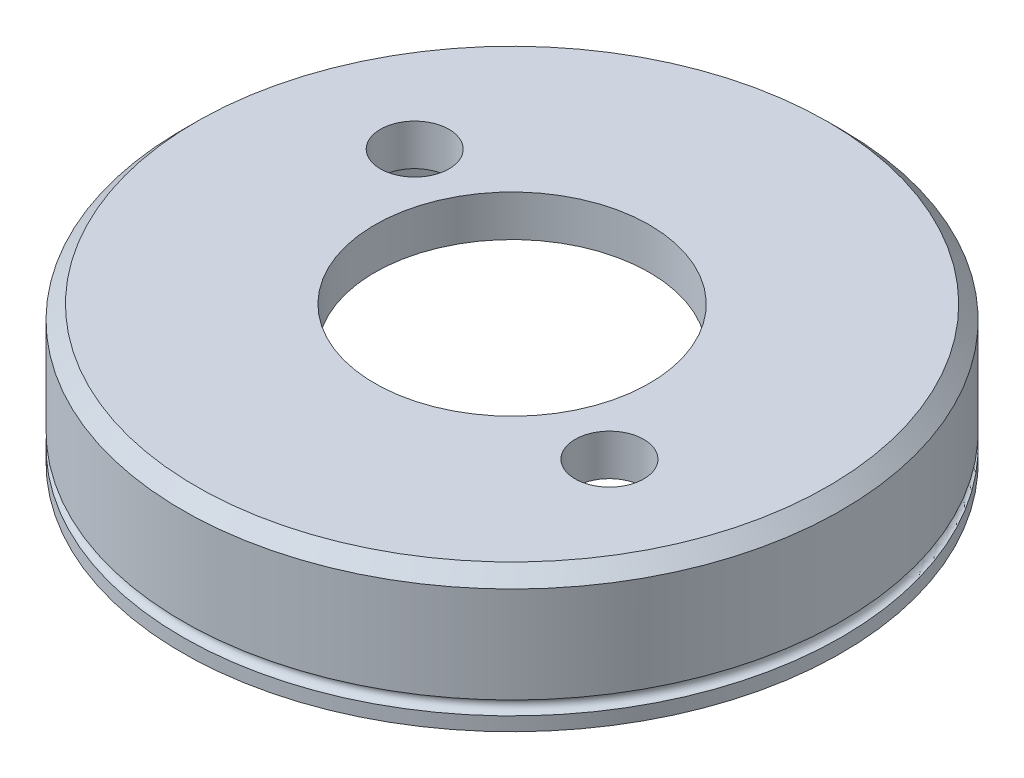
ISO-10303-21;
HEADER;
FILE_DESCRIPTION(('STEP AP214'),'2;1');
FILE_NAME('part.step','',(''),(''),'','','');
FILE_SCHEMA(('AUTOMOTIVE_DESIGN { 1 0 10303 214 1 1 1 1 }'));
ENDSEC;
DATA;
#1=APPLICATION_CONTEXT('core data for automotive mechanical design processes');
#2=APPLICATION_PROTOCOL_DEFINITION('international standard','automotive_design',2000,#1);
#3=PRODUCT_CONTEXT('',#1,'mechanical');
#4=PRODUCT('Part','Part','',(#3));
#5=PRODUCT_RELATED_PRODUCT_CATEGORY('part','',(#4));
#6=PRODUCT_DEFINITION_FORMATION('','',#4);
#7=PRODUCT_DEFINITION_CONTEXT('part definition',#1,'design');
#8=PRODUCT_DEFINITION('design','',#6,#7);
#9=PRODUCT_DEFINITION_SHAPE('','',#8);
#10=(LENGTH_UNIT() NAMED_UNIT(*) SI_UNIT(.MILLI.,.METRE.));
#11=(NAMED_UNIT(*) PLANE_ANGLE_UNIT() SI_UNIT($,.RADIAN.));
#12=(NAMED_UNIT(*) SI_UNIT($,.STERADIAN.) SOLID_ANGLE_UNIT());
#13=UNCERTAINTY_MEASURE_WITH_UNIT(LENGTH_MEASURE(1.E-05),#10,'distance_accuracy_value','');
#14=(GEOMETRIC_REPRESENTATION_CONTEXT(3) GLOBAL_UNCERTAINTY_ASSIGNED_CONTEXT((#13)) GLOBAL_UNIT_ASSIGNED_CONTEXT((#10,
#11,#12)) REPRESENTATION_CONTEXT('',''));
#15=CARTESIAN_POINT('',(0.,0.,0.));
#16=DIRECTION('',(0.,0.,1.));
#17=DIRECTION('',(1.,0.,0.));
#18=AXIS2_PLACEMENT_3D('',#15,#16,#17);
#19=CARTESIAN_POINT('',(-29.7531125863701,38.5083666055784,6.29915973865718));
#20=DIRECTION('',(0.,-1.,0.));
#21=DIRECTION('',(0.,0.,-1.));
#22=AXIS2_PLACEMENT_3D('',#19,#20,#21);
#23=CONICAL_SURFACE('',#22,11.7,0.785398163397483);
#24=CARTESIAN_POINT('',(-29.7531125863701,38.5083666055784,6.29915973865718));
#25=DIRECTION('',(0.,-1.,0.));
#26=DIRECTION('',(0.,0.,-1.));
#27=AXIS2_PLACEMENT_3D('',#24,#25,#26);
#28=CIRCLE('',#27,11.7);
#29=CARTESIAN_POINT('',(-29.7531125863701,38.5083666055784,-5.40084026134283));
#30=VERTEX_POINT('',#29);
#31=EDGE_CURVE('E17',#30,#30,#28,.T.);
#32=ORIENTED_EDGE('',*,*,#31,.T.);
#33=EDGE_LOOP('',(#32));
#34=FACE_BOUND('',#33,.T.);
#35=CARTESIAN_POINT('',(-29.7531125863701,38.6083666055784,6.29915973865718));
#36=DIRECTION('',(0.,-1.,0.));
#37=DIRECTION('',(0.,0.,-1.));
#38=AXIS2_PLACEMENT_3D('',#35,#36,#37);
#39=CIRCLE('',#38,11.6);
#40=CARTESIAN_POINT('',(-29.7531125863701,38.6083666055784,-5.30084026134284));
#41=VERTEX_POINT('',#40);
#42=EDGE_CURVE('E29',#41,#41,#39,.F.);
#43=ORIENTED_EDGE('',*,*,#42,.T.);
#44=EDGE_LOOP('',(#43));
#45=FACE_BOUND('',#44,.T.);
#46=ADVANCED_FACE('F14',(#34,#45),#23,.F.);
#47=CARTESIAN_POINT('',(-18.4721044198226,38.5083666055784,2.20784518874923));
#48=DIRECTION('',(0.,1.,0.));
#49=DIRECTION('',(0.,0.,1.));
#50=AXIS2_PLACEMENT_3D('',#47,#48,#49);
#51=PLANE('',#50);
#52=ORIENTED_EDGE('',*,*,#31,.F.);
#53=EDGE_LOOP('',(#52));
#54=FACE_BOUND('',#53,.T.);
#55=CARTESIAN_POINT('',(-29.7531125863701,38.5083666055784,6.29915973865718));
#56=DIRECTION('',(0.,-1.,0.));
#57=DIRECTION('',(0.,0.,-1.));
#58=AXIS2_PLACEMENT_3D('',#55,#56,#57);
#59=CIRCLE('',#58,12.);
#60=CARTESIAN_POINT('',(-29.7531125863701,38.5083666055784,-5.70084026134283));
#61=VERTEX_POINT('',#60);
#62=EDGE_CURVE('E57',#61,#61,#59,.F.);
#63=ORIENTED_EDGE('',*,*,#62,.F.);
#64=EDGE_LOOP('',(#63));
#65=FACE_BOUND('',#64,.T.);
#66=ADVANCED_FACE('F68',(#54,#65),#51,.F.);
#67=CARTESIAN_POINT('',(-29.7531125863701,113.69183853905,6.29915973865718));
#68=DIRECTION('',(0.,-1.,0.));
#69=DIRECTION('',(0.,0.,-1.));
#70=AXIS2_PLACEMENT_3D('',#67,#68,#69);
#71=CYLINDRICAL_SURFACE('',#70,11.6);
#72=CARTESIAN_POINT('',(-29.7531125863701,39.1083666055784,6.29915973865718));
#73=DIRECTION('',(0.,-1.,0.));
#74=DIRECTION('',(0.,0.,-1.));
#75=AXIS2_PLACEMENT_3D('',#72,#73,#74);
#76=CIRCLE('',#75,11.6);
#77=CARTESIAN_POINT('',(-29.7531125863701,39.1083666055784,-5.30084026134284));
#78=VERTEX_POINT('',#77);
#79=EDGE_CURVE('E55',#78,#78,#76,.F.);
#80=ORIENTED_EDGE('',*,*,#79,.T.);
#81=EDGE_LOOP('',(#80));
#82=FACE_BOUND('',#81,.T.);
#83=ORIENTED_EDGE('',*,*,#42,.F.);
#84=EDGE_LOOP('',(#83));
#85=FACE_BOUND('',#84,.T.);
#86=ADVANCED_FACE('F71',(#82,#85),#71,.F.);
#87=CARTESIAN_POINT('',(-29.7531125863701,113.69183853905,6.29915973865718));
#88=DIRECTION('',(0.,-1.,0.));
#89=DIRECTION('',(0.,0.,-1.));
#90=AXIS2_PLACEMENT_3D('',#87,#88,#89);
#91=CYLINDRICAL_SURFACE('',#90,12.);
#92=ORIENTED_EDGE('',*,*,#62,.T.);
#93=EDGE_LOOP('',(#92));
#94=FACE_BOUND('',#93,.T.);
#95=CARTESIAN_POINT('',(-29.7531125863701,39.0083666055784,6.29915973865718));
#96=DIRECTION('',(0.,1.,0.));
#97=DIRECTION('',(0.340942879158995,0.,0.940084013878959));
#98=AXIS2_PLACEMENT_3D('',#95,#96,#97);
#99=CIRCLE('',#98,12.);
#100=CARTESIAN_POINT('',(-25.6617980364622,39.0083666055784,17.5801679052047));
#101=VERTEX_POINT('',#100);
#102=EDGE_CURVE('E54',#101,#101,#99,.F.);
#103=ORIENTED_EDGE('',*,*,#102,.T.);
#104=EDGE_LOOP('',(#103));
#105=FACE_BOUND('',#104,.T.);
#106=ADVANCED_FACE('F77',(#94,#105),#91,.T.);
#107=CARTESIAN_POINT('',(-18.8481380253742,39.1083666055784,2.34422234041283));
#108=DIRECTION('',(0.,1.,0.));
#109=DIRECTION('',(0.,0.,1.));
#110=AXIS2_PLACEMENT_3D('',#107,#108,#109);
#111=PLANE('',#110);
#112=CARTESIAN_POINT('',(-29.7531125863701,39.1083666055784,6.29915973865718));
#113=DIRECTION('',(0.,-1.,0.));
#114=DIRECTION('',(0.,0.,-1.));
#115=AXIS2_PLACEMENT_3D('',#112,#113,#114);
#116=CIRCLE('',#115,11.25);
#117=CARTESIAN_POINT('',(-29.7531125863701,39.1083666055784,-4.95084026134283));
#118=VERTEX_POINT('',#117);
#119=EDGE_CURVE('E51',#118,#118,#116,.F.);
#120=ORIENTED_EDGE('',*,*,#119,.T.);
#121=EDGE_LOOP('',(#120));
#122=FACE_BOUND('',#121,.T.);
#123=ORIENTED_EDGE('',*,*,#79,.F.);
#124=EDGE_LOOP('',(#123));
#125=FACE_BOUND('',#124,.T.);
#126=ADVANCED_FACE('F119',(#122,#125),#111,.F.);
#127=CARTESIAN_POINT('',(-29.7531125863701,39.2583666055784,6.29915973865718));
#128=DIRECTION('',(0.,1.,0.));
#129=DIRECTION('',(0.340942879158995,0.,0.940084013878959));
#130=AXIS2_PLACEMENT_3D('',#127,#128,#129);
#131=TOROIDAL_SURFACE('',#130,12.,0.25);
#132=ORIENTED_EDGE('',*,*,#102,.F.);
#133=EDGE_LOOP('',(#132));
#134=FACE_BOUND('',#133,.T.);
#135=CARTESIAN_POINT('',(-29.7531125863701,39.5083666055784,6.29915973865718));
#136=DIRECTION('',(0.,-1.,0.));
#137=DIRECTION('',(0.,0.,-1.));
#138=AXIS2_PLACEMENT_3D('',#135,#136,#137);
#139=CIRCLE('',#138,12.);
#140=CARTESIAN_POINT('',(-29.7531125863701,39.5083666055784,-5.70084026134283));
#141=VERTEX_POINT('',#140);
#142=EDGE_CURVE('E50',#141,#141,#139,.F.);
#143=ORIENTED_EDGE('',*,*,#142,.F.);
#144=EDGE_LOOP('',(#143));
#145=FACE_BOUND('',#144,.T.);
#146=ADVANCED_FACE('F114',(#134,#145),#131,.F.);
#147=CARTESIAN_POINT('',(-29.7531125863701,113.69183853905,6.29915973865718));
#148=DIRECTION('',(0.,-1.,0.));
#149=DIRECTION('',(0.,0.,-1.));
#150=AXIS2_PLACEMENT_3D('',#147,#148,#149);
#151=CYLINDRICAL_SURFACE('',#150,11.25);
#152=CARTESIAN_POINT('',(-29.7531125863701,42.0083666055784,6.29915973865718));
#153=DIRECTION('',(0.,-1.,0.));
#154=DIRECTION('',(0.,0.,-1.));
#155=AXIS2_PLACEMENT_3D('',#152,#153,#154);
#156=CIRCLE('',#155,11.25);
#157=CARTESIAN_POINT('',(-29.7531125863701,42.0083666055784,-4.95084026134283));
#158=VERTEX_POINT('',#157);
#159=EDGE_CURVE('E47',#158,#158,#156,.F.);
#160=ORIENTED_EDGE('',*,*,#159,.T.);
#161=EDGE_LOOP('',(#160));
#162=FACE_BOUND('',#161,.T.);
#163=ORIENTED_EDGE('',*,*,#119,.F.);
#164=EDGE_LOOP('',(#163));
#165=FACE_BOUND('',#164,.T.);
#166=ADVANCED_FACE('F110',(#162,#165),#151,.F.);
#167=CARTESIAN_POINT('',(-29.7531125863701,113.69183853905,6.29915973865718));
#168=DIRECTION('',(0.,-1.,0.));
#169=DIRECTION('',(0.,0.,-1.));
#170=AXIS2_PLACEMENT_3D('',#167,#168,#169);
#171=CYLINDRICAL_SURFACE('',#170,12.);
#172=CARTESIAN_POINT('',(-29.7531125863701,43.0083666055784,6.29915973865718));
#173=DIRECTION('',(0.,-1.,0.));
#174=DIRECTION('',(-0.340942879158995,0.,-0.940084013878959));
#175=AXIS2_PLACEMENT_3D('',#172,#173,#174);
#176=CIRCLE('',#175,12.);
#177=CARTESIAN_POINT('',(-33.8444271362781,43.0083666055784,-4.98184842789034));
#178=VERTEX_POINT('',#177);
#179=EDGE_CURVE('E46',#178,#178,#176,.F.);
#180=ORIENTED_EDGE('',*,*,#179,.F.);
#181=EDGE_LOOP('',(#180));
#182=FACE_BOUND('',#181,.T.);
#183=ORIENTED_EDGE('',*,*,#142,.T.);
#184=EDGE_LOOP('',(#183));
#185=FACE_BOUND('',#184,.T.);
#186=ADVANCED_FACE('F106',(#182,#185),#171,.T.);
#187=CARTESIAN_POINT('',(-19.1771674302318,42.0083666055784,2.46355234811848));
#188=DIRECTION('',(0.,1.,0.));
#189=DIRECTION('',(0.,0.,1.));
#190=AXIS2_PLACEMENT_3D('',#187,#188,#189);
#191=PLANE('',#190);
#192=CARTESIAN_POINT('',(-29.7531125863701,42.0083666055784,6.29915973865718));
#193=DIRECTION('',(0.,-1.,0.));
#194=DIRECTION('',(0.,0.,-1.));
#195=AXIS2_PLACEMENT_3D('',#192,#193,#194);
#196=CIRCLE('',#195,5.00000000000001);
#197=CARTESIAN_POINT('',(-29.7531125863701,42.0083666055784,1.29915973865717));
#198=VERTEX_POINT('',#197);
#199=EDGE_CURVE('E37',#198,#198,#196,.F.);
#200=ORIENTED_EDGE('',*,*,#199,.T.);
#201=EDGE_LOOP('',(#200));
#202=FACE_BOUND('',#201,.T.);
#203=CARTESIAN_POINT('',(-23.0917727425728,42.0083666055784,9.41469363920099));
#204=DIRECTION('',(0.,-1.,0.));
#205=DIRECTION('',(0.,0.,-1.));
#206=AXIS2_PLACEMENT_3D('',#203,#204,#205);
#207=CIRCLE('',#206,1.25);
#208=CARTESIAN_POINT('',(-23.0917727425728,42.0083666055784,8.16469363920099));
#209=VERTEX_POINT('',#208);
#210=EDGE_CURVE('E40',#209,#209,#207,.F.);
#211=ORIENTED_EDGE('',*,*,#210,.T.);
#212=EDGE_LOOP('',(#211));
#213=FACE_BOUND('',#212,.T.);
#214=CARTESIAN_POINT('',(-36.4144524301675,42.0083666055784,3.18362583811336));
#215=DIRECTION('',(0.,-1.,0.));
#216=DIRECTION('',(0.,0.,-1.));
#217=AXIS2_PLACEMENT_3D('',#214,#215,#216);
#218=CIRCLE('',#217,1.25);
#219=CARTESIAN_POINT('',(-36.4144524301675,42.0083666055784,1.93362583811336));
#220=VERTEX_POINT('',#219);
#221=EDGE_CURVE('E43',#220,#220,#218,.F.);
#222=ORIENTED_EDGE('',*,*,#221,.T.);
#223=EDGE_LOOP('',(#222));
#224=FACE_BOUND('',#223,.T.);
#225=ORIENTED_EDGE('',*,*,#159,.F.);
#226=EDGE_LOOP('',(#225));
#227=FACE_BOUND('',#226,.T.);
#228=ADVANCED_FACE('F102',(#202,#213,#224,#227),#191,.F.);
#229=CARTESIAN_POINT('',(-29.7531125863701,43.0083666055784,6.29915973865718));
#230=DIRECTION('',(0.,-1.,0.));
#231=DIRECTION('',(0.,0.,-1.));
#232=AXIS2_PLACEMENT_3D('',#229,#230,#231);
#233=CONICAL_SURFACE('',#232,12.,0.785398163397443);
#234=ORIENTED_EDGE('',*,*,#179,.T.);
#235=EDGE_LOOP('',(#234));
#236=FACE_BOUND('',#235,.T.);
#237=CARTESIAN_POINT('',(-29.7531125863701,43.5083666055784,6.29915973865718));
#238=DIRECTION('',(0.,-1.,0.));
#239=DIRECTION('',(0.,0.,-1.));
#240=AXIS2_PLACEMENT_3D('',#237,#238,#239);
#241=CIRCLE('',#240,11.5);
#242=CARTESIAN_POINT('',(-29.7531125863701,43.5083666055784,-5.20084026134285));
#243=VERTEX_POINT('',#242);
#244=EDGE_CURVE('E34',#243,#243,#241,.T.);
#245=ORIENTED_EDGE('',*,*,#244,.T.);
#246=EDGE_LOOP('',(#245));
#247=FACE_BOUND('',#246,.T.);
#248=ADVANCED_FACE('F98',(#236,#247),#233,.T.);
#249=CARTESIAN_POINT('',(-36.4144524301675,43.5083666055784,3.18362583811336));
#250=DIRECTION('',(0.,-1.,0.));
#251=DIRECTION('',(0.,0.,-1.));
#252=AXIS2_PLACEMENT_3D('',#249,#250,#251);
#253=CYLINDRICAL_SURFACE('',#252,1.25);
#254=CARTESIAN_POINT('',(-36.4144524301675,43.5083666055784,3.18362583811336));
#255=DIRECTION('',(0.,-1.,0.));
#256=DIRECTION('',(0.,0.,-1.));
#257=AXIS2_PLACEMENT_3D('',#254,#255,#256);
#258=CIRCLE('',#257,1.25);
#259=CARTESIAN_POINT('',(-36.4144524301675,43.5083666055784,1.93362583811336));
#260=VERTEX_POINT('',#259);
#261=EDGE_CURVE('E26',#260,#260,#258,.F.);
#262=ORIENTED_EDGE('',*,*,#261,.T.);
#263=EDGE_LOOP('',(#262));
#264=FACE_BOUND('',#263,.T.);
#265=ORIENTED_EDGE('',*,*,#221,.F.);
#266=EDGE_LOOP('',(#265));
#267=FACE_BOUND('',#266,.T.);
#268=ADVANCED_FACE('F94',(#264,#267),#253,.F.);
#269=CARTESIAN_POINT('',(-23.0917727425728,43.5083666055784,9.41469363920099));
#270=DIRECTION('',(0.,-1.,0.));
#271=DIRECTION('',(0.,0.,-1.));
#272=AXIS2_PLACEMENT_3D('',#269,#270,#271);
#273=CYLINDRICAL_SURFACE('',#272,1.25);
#274=CARTESIAN_POINT('',(-23.0917727425728,43.5083666055784,9.41469363920099));
#275=DIRECTION('',(0.,-1.,0.));
#276=DIRECTION('',(0.,0.,-1.));
#277=AXIS2_PLACEMENT_3D('',#274,#275,#276);
#278=CIRCLE('',#277,1.25);
#279=CARTESIAN_POINT('',(-23.0917727425728,43.5083666055784,8.16469363920099));
#280=VERTEX_POINT('',#279);
#281=EDGE_CURVE('E21',#280,#280,#278,.F.);
#282=ORIENTED_EDGE('',*,*,#281,.T.);
#283=EDGE_LOOP('',(#282));
#284=FACE_BOUND('',#283,.T.);
#285=ORIENTED_EDGE('',*,*,#210,.F.);
#286=EDGE_LOOP('',(#285));
#287=FACE_BOUND('',#286,.T.);
#288=ADVANCED_FACE('F88',(#284,#287),#273,.F.);
#289=CARTESIAN_POINT('',(-29.7531125863701,113.69183853905,6.29915973865718));
#290=DIRECTION('',(0.,-1.,0.));
#291=DIRECTION('',(0.,0.,-1.));
#292=AXIS2_PLACEMENT_3D('',#289,#290,#291);
#293=CYLINDRICAL_SURFACE('',#292,5.00000000000001);
#294=CARTESIAN_POINT('',(-29.7531125863701,43.5083666055784,6.29915973865718));
#295=DIRECTION('',(0.,-1.,0.));
#296=DIRECTION('',(0.,0.,-1.));
#297=AXIS2_PLACEMENT_3D('',#294,#295,#296);
#298=CIRCLE('',#297,5.00000000000001);
#299=CARTESIAN_POINT('',(-29.7531125863701,43.5083666055784,1.29915973865717));
#300=VERTEX_POINT('',#299);
#301=EDGE_CURVE('E10',#300,#300,#298,.F.);
#302=ORIENTED_EDGE('',*,*,#301,.T.);
#303=EDGE_LOOP('',(#302));
#304=FACE_BOUND('',#303,.T.);
#305=ORIENTED_EDGE('',*,*,#199,.F.);
#306=EDGE_LOOP('',(#305));
#307=FACE_BOUND('',#306,.T.);
#308=ADVANCED_FACE('F82',(#304,#307),#293,.F.);
#309=CARTESIAN_POINT('',(-25.0526925169753,43.5083666055784,4.5944453428622));
#310=DIRECTION('',(0.,-1.,0.));
#311=DIRECTION('',(0.,0.,-1.));
#312=AXIS2_PLACEMENT_3D('',#309,#310,#311);
#313=PLANE('',#312);
#314=ORIENTED_EDGE('',*,*,#301,.F.);
#315=EDGE_LOOP('',(#314));
#316=FACE_BOUND('',#315,.T.);
#317=ORIENTED_EDGE('',*,*,#281,.F.);
#318=EDGE_LOOP('',(#317));
#319=FACE_BOUND('',#318,.T.);
#320=ORIENTED_EDGE('',*,*,#261,.F.);
#321=EDGE_LOOP('',(#320));
#322=FACE_BOUND('',#321,.T.);
#323=ORIENTED_EDGE('',*,*,#244,.F.);
#324=EDGE_LOOP('',(#323));
#325=FACE_BOUND('',#324,.T.);
#326=ADVANCED_FACE('F80',(#316,#319,#322,#325),#313,.F.);
#327=CLOSED_SHELL('',(#46,#66,#86,#106,#126,#146,#166,#186,#228,#248,#268,#288,#308,#326));
#328=MANIFOLD_SOLID_BREP('B1',#327);
#329=ADVANCED_BREP_SHAPE_REPRESENTATION('',(#18,#328),#14);
#330=SHAPE_DEFINITION_REPRESENTATION(#9,#329);
ENDSEC;
END-ISO-10303-21;
